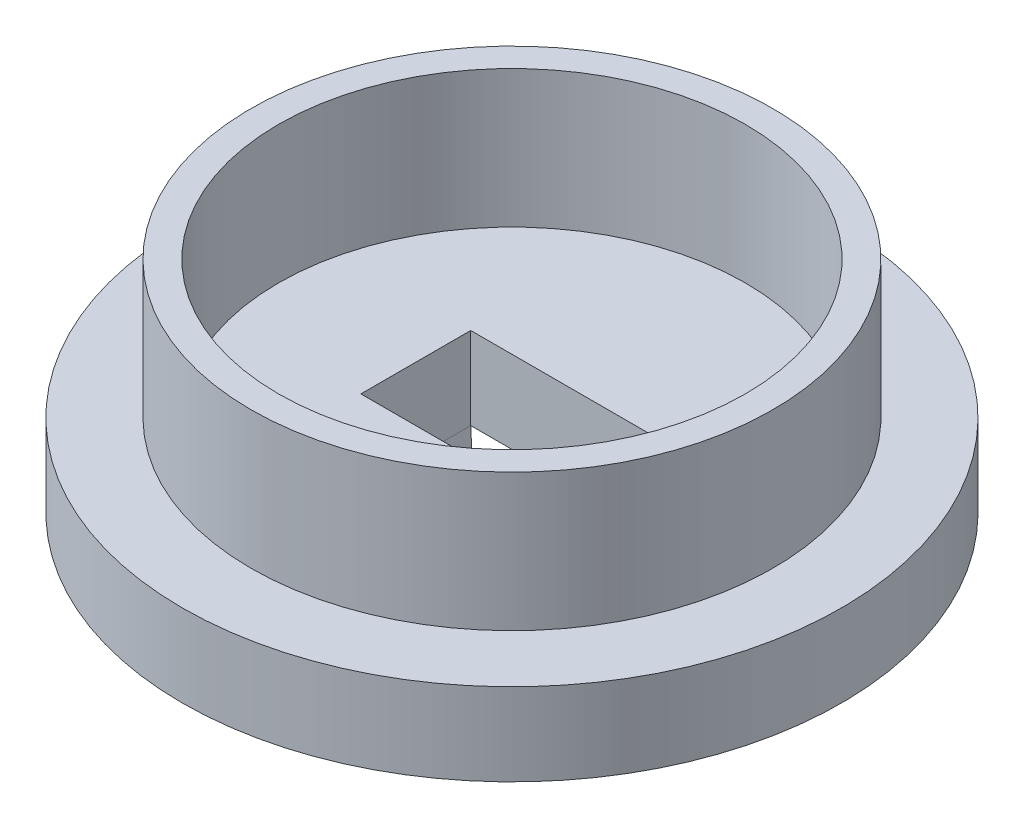
ISO-10303-21;
HEADER;
FILE_DESCRIPTION(('STEP AP214'),'2;1');
FILE_NAME('part.step','',(''),(''),'','','');
FILE_SCHEMA(('AUTOMOTIVE_DESIGN { 1 0 10303 214 1 1 1 1 }'));
ENDSEC;
DATA;
#1=APPLICATION_CONTEXT('core data for automotive mechanical design processes');
#2=APPLICATION_PROTOCOL_DEFINITION('international standard','automotive_design',2000,#1);
#3=PRODUCT_CONTEXT('',#1,'mechanical');
#4=PRODUCT('Part','Part','',(#3));
#5=PRODUCT_RELATED_PRODUCT_CATEGORY('part','',(#4));
#6=PRODUCT_DEFINITION_FORMATION('','',#4);
#7=PRODUCT_DEFINITION_CONTEXT('part definition',#1,'design');
#8=PRODUCT_DEFINITION('design','',#6,#7);
#9=PRODUCT_DEFINITION_SHAPE('','',#8);
#10=(LENGTH_UNIT() NAMED_UNIT(*) SI_UNIT(.MILLI.,.METRE.));
#11=(NAMED_UNIT(*) PLANE_ANGLE_UNIT() SI_UNIT($,.RADIAN.));
#12=(NAMED_UNIT(*) SI_UNIT($,.STERADIAN.) SOLID_ANGLE_UNIT());
#13=UNCERTAINTY_MEASURE_WITH_UNIT(LENGTH_MEASURE(1.E-05),#10,'distance_accuracy_value','');
#14=(GEOMETRIC_REPRESENTATION_CONTEXT(3) GLOBAL_UNCERTAINTY_ASSIGNED_CONTEXT((#13)) GLOBAL_UNIT_ASSIGNED_CONTEXT((#10,
#11,#12)) REPRESENTATION_CONTEXT('',''));
#15=CARTESIAN_POINT('',(0.,0.,0.));
#16=DIRECTION('',(0.,0.,1.));
#17=DIRECTION('',(1.,0.,0.));
#18=AXIS2_PLACEMENT_3D('',#15,#16,#17);
#19=CARTESIAN_POINT('',(0.,3.,0.));
#20=DIRECTION('',(0.,-1.,0.));
#21=DIRECTION('',(0.,0.,-1.));
#22=AXIS2_PLACEMENT_3D('',#19,#20,#21);
#23=CYLINDRICAL_SURFACE('',#22,12.);
#24=CARTESIAN_POINT('',(0.,3.,0.));
#25=DIRECTION('',(0.,1.,0.));
#26=DIRECTION('',(0.,0.,1.));
#27=AXIS2_PLACEMENT_3D('',#24,#25,#26);
#28=CIRCLE('',#27,12.);
#29=CARTESIAN_POINT('',(0.,3.,12.));
#30=VERTEX_POINT('',#29);
#31=EDGE_CURVE('E209',#30,#30,#28,.T.);
#32=ORIENTED_EDGE('',*,*,#31,.F.);
#33=EDGE_LOOP('',(#32));
#34=FACE_BOUND('',#33,.T.);
#35=CARTESIAN_POINT('',(0.,0.,0.));
#36=DIRECTION('',(0.,1.,0.));
#37=DIRECTION('',(0.,0.,1.));
#38=AXIS2_PLACEMENT_3D('',#35,#36,#37);
#39=CIRCLE('',#38,12.);
#40=CARTESIAN_POINT('',(0.,0.,12.));
#41=VERTEX_POINT('',#40);
#42=EDGE_CURVE('E206',#41,#41,#39,.T.);
#43=ORIENTED_EDGE('',*,*,#42,.T.);
#44=EDGE_LOOP('',(#43));
#45=FACE_BOUND('',#44,.T.);
#46=ADVANCED_FACE('F33',(#34,#45),#23,.T.);
#47=CARTESIAN_POINT('',(0.,3.,0.));
#48=DIRECTION('',(0.,1.,0.));
#49=DIRECTION('',(0.,0.,1.));
#50=AXIS2_PLACEMENT_3D('',#47,#48,#49);
#51=PLANE('',#50);
#52=CARTESIAN_POINT('',(0.,3.,0.));
#53=DIRECTION('',(0.,1.,0.));
#54=DIRECTION('',(0.,0.,1.));
#55=AXIS2_PLACEMENT_3D('',#52,#53,#54);
#56=CIRCLE('',#55,9.5);
#57=CARTESIAN_POINT('',(0.,3.,9.5));
#58=VERTEX_POINT('',#57);
#59=EDGE_CURVE('E202',#58,#58,#56,.T.);
#60=ORIENTED_EDGE('',*,*,#59,.F.);
#61=EDGE_LOOP('',(#60));
#62=FACE_BOUND('',#61,.T.);
#63=ORIENTED_EDGE('',*,*,#31,.T.);
#64=EDGE_LOOP('',(#63));
#65=FACE_BOUND('',#64,.T.);
#66=ADVANCED_FACE('F267',(#62,#65),#51,.T.);
#67=CARTESIAN_POINT('',(0.,0.,0.));
#68=DIRECTION('',(0.,1.,0.));
#69=DIRECTION('',(0.,0.,1.));
#70=AXIS2_PLACEMENT_3D('',#67,#68,#69);
#71=PLANE('',#70);
#72=DIRECTION('',(-1.,0.,0.));
#73=VECTOR('',#72,1.);
#74=CARTESIAN_POINT('',(-3.5,0.,2.));
#75=LINE('',#74,#73);
#76=CARTESIAN_POINT('',(3.5,0.,2.));
#77=VERTEX_POINT('',#76);
#78=CARTESIAN_POINT('',(-3.5,0.,2.));
#79=VERTEX_POINT('',#78);
#80=EDGE_CURVE('E181',#77,#79,#75,.T.);
#81=ORIENTED_EDGE('',*,*,#80,.F.);
#82=DIRECTION('',(-1.,0.,0.));
#83=VECTOR('',#82,1.);
#84=CARTESIAN_POINT('',(4.9,0.,2.));
#85=LINE('',#84,#83);
#86=CARTESIAN_POINT('',(4.9,0.,2.));
#87=VERTEX_POINT('',#86);
#88=EDGE_CURVE('E47',#87,#77,#85,.T.);
#89=ORIENTED_EDGE('',*,*,#88,.F.);
#90=DIRECTION('',(0.,0.,-1.));
#91=VECTOR('',#90,1.);
#92=CARTESIAN_POINT('',(4.9,0.,13.0018180315801));
#93=LINE('',#92,#91);
#94=CARTESIAN_POINT('',(4.9,0.,-2.));
#95=VERTEX_POINT('',#94);
#96=EDGE_CURVE('E173',#87,#95,#93,.T.);
#97=ORIENTED_EDGE('',*,*,#96,.T.);
#98=DIRECTION('',(-1.,0.,0.));
#99=VECTOR('',#98,1.);
#100=CARTESIAN_POINT('',(4.9,0.,-2.));
#101=LINE('',#100,#99);
#102=CARTESIAN_POINT('',(3.5,0.,-2.));
#103=VERTEX_POINT('',#102);
#104=EDGE_CURVE('E148',#95,#103,#101,.T.);
#105=ORIENTED_EDGE('',*,*,#104,.T.);
#106=DIRECTION('',(1.,0.,0.));
#107=VECTOR('',#106,1.);
#108=CARTESIAN_POINT('',(-3.5,0.,-2.));
#109=LINE('',#108,#107);
#110=CARTESIAN_POINT('',(-3.5,0.,-2.));
#111=VERTEX_POINT('',#110);
#112=EDGE_CURVE('E186',#111,#103,#109,.T.);
#113=ORIENTED_EDGE('',*,*,#112,.F.);
#114=DIRECTION('',(-1.,0.,0.));
#115=VECTOR('',#114,1.);
#116=CARTESIAN_POINT('',(-3.5,0.,-2.));
#117=LINE('',#116,#115);
#118=CARTESIAN_POINT('',(-4.9,0.,-2.));
#119=VERTEX_POINT('',#118);
#120=EDGE_CURVE('E138',#111,#119,#117,.T.);
#121=ORIENTED_EDGE('',*,*,#120,.T.);
#122=DIRECTION('',(0.,0.,-1.));
#123=VECTOR('',#122,1.);
#124=CARTESIAN_POINT('',(-4.9,0.,13.0018180315801));
#125=LINE('',#124,#123);
#126=CARTESIAN_POINT('',(-4.9,0.,2.));
#127=VERTEX_POINT('',#126);
#128=EDGE_CURVE('E122',#127,#119,#125,.T.);
#129=ORIENTED_EDGE('',*,*,#128,.F.);
#130=DIRECTION('',(-1.,0.,0.));
#131=VECTOR('',#130,1.);
#132=CARTESIAN_POINT('',(-3.5,0.,2.));
#133=LINE('',#132,#131);
#134=EDGE_CURVE('E164',#79,#127,#133,.T.);
#135=ORIENTED_EDGE('',*,*,#134,.F.);
#136=EDGE_LOOP('',(#81,#89,#97,#105,#113,#121,#129,#135));
#137=FACE_BOUND('',#136,.T.);
#138=ORIENTED_EDGE('',*,*,#42,.F.);
#139=EDGE_LOOP('',(#138));
#140=FACE_BOUND('',#139,.T.);
#141=ADVANCED_FACE('F246',(#137,#140),#71,.F.);
#142=CARTESIAN_POINT('',(0.,8.,0.));
#143=DIRECTION('',(0.,1.,0.));
#144=DIRECTION('',(0.,0.,1.));
#145=AXIS2_PLACEMENT_3D('',#142,#143,#144);
#146=PLANE('',#145);
#147=CARTESIAN_POINT('',(0.,8.,0.));
#148=DIRECTION('',(0.,1.,0.));
#149=DIRECTION('',(0.,0.,1.));
#150=AXIS2_PLACEMENT_3D('',#147,#148,#149);
#151=CIRCLE('',#150,9.5);
#152=CARTESIAN_POINT('',(0.,8.,9.5));
#153=VERTEX_POINT('',#152);
#154=EDGE_CURVE('E203',#153,#153,#151,.T.);
#155=ORIENTED_EDGE('',*,*,#154,.T.);
#156=EDGE_LOOP('',(#155));
#157=FACE_BOUND('',#156,.T.);
#158=CARTESIAN_POINT('',(0.,8.,0.));
#159=DIRECTION('',(0.,1.,0.));
#160=DIRECTION('',(0.,0.,1.));
#161=AXIS2_PLACEMENT_3D('',#158,#159,#160);
#162=CIRCLE('',#161,8.5);
#163=CARTESIAN_POINT('',(0.,8.,8.5));
#164=VERTEX_POINT('',#163);
#165=EDGE_CURVE('E193',#164,#164,#162,.T.);
#166=ORIENTED_EDGE('',*,*,#165,.F.);
#167=EDGE_LOOP('',(#166));
#168=FACE_BOUND('',#167,.T.);
#169=ADVANCED_FACE('F278',(#157,#168),#146,.T.);
#170=CARTESIAN_POINT('',(0.,8.,0.));
#171=DIRECTION('',(0.,-1.,0.));
#172=DIRECTION('',(0.,0.,-1.));
#173=AXIS2_PLACEMENT_3D('',#170,#171,#172);
#174=CYLINDRICAL_SURFACE('',#173,9.5);
#175=ORIENTED_EDGE('',*,*,#154,.F.);
#176=EDGE_LOOP('',(#175));
#177=FACE_BOUND('',#176,.T.);
#178=ORIENTED_EDGE('',*,*,#59,.T.);
#179=EDGE_LOOP('',(#178));
#180=FACE_BOUND('',#179,.T.);
#181=ADVANCED_FACE('F282',(#177,#180),#174,.T.);
#182=CARTESIAN_POINT('',(0.,8.,0.));
#183=DIRECTION('',(0.,-1.,0.));
#184=DIRECTION('',(0.,0.,-1.));
#185=AXIS2_PLACEMENT_3D('',#182,#183,#184);
#186=CYLINDRICAL_SURFACE('',#185,8.5);
#187=ORIENTED_EDGE('',*,*,#165,.T.);
#188=EDGE_LOOP('',(#187));
#189=FACE_BOUND('',#188,.T.);
#190=CARTESIAN_POINT('',(0.,3.,0.));
#191=DIRECTION('',(0.,1.,0.));
#192=DIRECTION('',(0.,0.,1.));
#193=AXIS2_PLACEMENT_3D('',#190,#191,#192);
#194=CIRCLE('',#193,8.5);
#195=CARTESIAN_POINT('',(0.,3.,8.5));
#196=VERTEX_POINT('',#195);
#197=EDGE_CURVE('E212',#196,#196,#194,.F.);
#198=ORIENTED_EDGE('',*,*,#197,.T.);
#199=EDGE_LOOP('',(#198));
#200=FACE_BOUND('',#199,.T.);
#201=ADVANCED_FACE('F287',(#189,#200),#186,.F.);
#202=DIRECTION('',(0.,0.,-1.));
#203=VECTOR('',#202,1.);
#204=CARTESIAN_POINT('',(3.5,3.,0.));
#205=LINE('',#204,#203);
#206=CARTESIAN_POINT('',(3.5,3.,2.));
#207=VERTEX_POINT('',#206);
#208=CARTESIAN_POINT('',(3.5,3.,-2.));
#209=VERTEX_POINT('',#208);
#210=EDGE_CURVE('E11',#207,#209,#205,.T.);
#211=ORIENTED_EDGE('',*,*,#210,.F.);
#212=DIRECTION('',(1.,0.,0.));
#213=VECTOR('',#212,1.);
#214=CARTESIAN_POINT('',(0.,3.,2.));
#215=LINE('',#214,#213);
#216=CARTESIAN_POINT('',(-3.5,3.,2.));
#217=VERTEX_POINT('',#216);
#218=EDGE_CURVE('E217',#217,#207,#215,.T.);
#219=ORIENTED_EDGE('',*,*,#218,.F.);
#220=DIRECTION('',(0.,0.,1.));
#221=VECTOR('',#220,1.);
#222=CARTESIAN_POINT('',(-3.5,3.,0.));
#223=LINE('',#222,#221);
#224=CARTESIAN_POINT('',(-3.5,3.,-2.));
#225=VERTEX_POINT('',#224);
#226=EDGE_CURVE('E219',#225,#217,#223,.T.);
#227=ORIENTED_EDGE('',*,*,#226,.F.);
#228=DIRECTION('',(-1.,0.,0.));
#229=VECTOR('',#228,1.);
#230=CARTESIAN_POINT('',(0.,3.,-2.));
#231=LINE('',#230,#229);
#232=EDGE_CURVE('E40',#209,#225,#231,.T.);
#233=ORIENTED_EDGE('',*,*,#232,.F.);
#234=EDGE_LOOP('',(#211,#219,#227,#233));
#235=FACE_BOUND('',#234,.T.);
#236=ORIENTED_EDGE('',*,*,#197,.F.);
#237=EDGE_LOOP('',(#236));
#238=FACE_BOUND('',#237,.T.);
#239=ADVANCED_FACE('F232',(#235,#238),#51,.T.);
#240=CARTESIAN_POINT('',(3.5,8.,2.));
#241=DIRECTION('',(1.,0.,0.));
#242=DIRECTION('',(0.,0.,-1.));
#243=AXIS2_PLACEMENT_3D('',#240,#241,#242);
#244=PLANE('',#243);
#245=ORIENTED_EDGE('',*,*,#210,.T.);
#246=DIRECTION('',(0.,-1.,0.));
#247=VECTOR('',#246,1.);
#248=CARTESIAN_POINT('',(3.5,8.,-2.));
#249=LINE('',#248,#247);
#250=EDGE_CURVE('E190',#209,#103,#249,.T.);
#251=ORIENTED_EDGE('',*,*,#250,.T.);
#252=DIRECTION('',(0.,0.,1.));
#253=VECTOR('',#252,1.);
#254=CARTESIAN_POINT('',(3.5,0.,2.));
#255=LINE('',#254,#253);
#256=EDGE_CURVE('E155',#103,#77,#255,.T.);
#257=ORIENTED_EDGE('',*,*,#256,.T.);
#258=DIRECTION('',(0.,-1.,0.));
#259=VECTOR('',#258,1.);
#260=CARTESIAN_POINT('',(3.5,8.,2.));
#261=LINE('',#260,#259);
#262=EDGE_CURVE('E189',#207,#77,#261,.T.);
#263=ORIENTED_EDGE('',*,*,#262,.F.);
#264=EDGE_LOOP('',(#245,#251,#257,#263));
#265=FACE_BOUND('',#264,.T.);
#266=ADVANCED_FACE('F238',(#265),#244,.F.);
#267=CARTESIAN_POINT('',(-3.5,8.,-2.));
#268=DIRECTION('',(0.,0.,-1.));
#269=DIRECTION('',(-1.,0.,0.));
#270=AXIS2_PLACEMENT_3D('',#267,#268,#269);
#271=PLANE('',#270);
#272=ORIENTED_EDGE('',*,*,#232,.T.);
#273=DIRECTION('',(0.,-1.,0.));
#274=VECTOR('',#273,1.);
#275=CARTESIAN_POINT('',(-3.5,8.,-2.));
#276=LINE('',#275,#274);
#277=EDGE_CURVE('E194',#225,#111,#276,.T.);
#278=ORIENTED_EDGE('',*,*,#277,.T.);
#279=ORIENTED_EDGE('',*,*,#112,.T.);
#280=ORIENTED_EDGE('',*,*,#250,.F.);
#281=EDGE_LOOP('',(#272,#278,#279,#280));
#282=FACE_BOUND('',#281,.T.);
#283=ADVANCED_FACE('F224',(#282),#271,.F.);
#284=CARTESIAN_POINT('',(-3.5,8.,2.));
#285=DIRECTION('',(-1.,0.,0.));
#286=DIRECTION('',(0.,0.,1.));
#287=AXIS2_PLACEMENT_3D('',#284,#285,#286);
#288=PLANE('',#287);
#289=ORIENTED_EDGE('',*,*,#226,.T.);
#290=DIRECTION('',(0.,-1.,0.));
#291=VECTOR('',#290,1.);
#292=CARTESIAN_POINT('',(-3.5,8.,2.));
#293=LINE('',#292,#291);
#294=EDGE_CURVE('E55',#217,#79,#293,.T.);
#295=ORIENTED_EDGE('',*,*,#294,.T.);
#296=DIRECTION('',(0.,0.,-1.));
#297=VECTOR('',#296,1.);
#298=CARTESIAN_POINT('',(-3.5,0.,2.));
#299=LINE('',#298,#297);
#300=EDGE_CURVE('E183',#79,#111,#299,.T.);
#301=ORIENTED_EDGE('',*,*,#300,.T.);
#302=ORIENTED_EDGE('',*,*,#277,.F.);
#303=EDGE_LOOP('',(#289,#295,#301,#302));
#304=FACE_BOUND('',#303,.T.);
#305=ADVANCED_FACE('F229',(#304),#288,.F.);
#306=CARTESIAN_POINT('',(-3.5,8.,2.));
#307=DIRECTION('',(0.,0.,1.));
#308=DIRECTION('',(1.,0.,0.));
#309=AXIS2_PLACEMENT_3D('',#306,#307,#308);
#310=PLANE('',#309);
#311=ORIENTED_EDGE('',*,*,#218,.T.);
#312=ORIENTED_EDGE('',*,*,#262,.T.);
#313=ORIENTED_EDGE('',*,*,#80,.T.);
#314=ORIENTED_EDGE('',*,*,#294,.F.);
#315=EDGE_LOOP('',(#311,#312,#313,#314));
#316=FACE_BOUND('',#315,.T.);
#317=ADVANCED_FACE('F235',(#316),#310,.F.);
#318=CARTESIAN_POINT('',(-4.9,0.,13.0018180315801));
#319=DIRECTION('',(0.998752338877845,0.0499376169438925,0.));
#320=DIRECTION('',(-0.0499376169438925,0.998752338877845,0.));
#321=AXIS2_PLACEMENT_3D('',#318,#319,#320);
#322=PLANE('',#321);
#323=DIRECTION('',(0.0499376169438925,-0.998752338877845,0.));
#324=VECTOR('',#323,1.);
#325=CARTESIAN_POINT('',(-4.9,0.,2.));
#326=LINE('',#325,#324);
#327=CARTESIAN_POINT('',(-4.65,-5.,2.));
#328=VERTEX_POINT('',#327);
#329=EDGE_CURVE('E162',#127,#328,#326,.T.);
#330=ORIENTED_EDGE('',*,*,#329,.F.);
#331=ORIENTED_EDGE('',*,*,#128,.T.);
#332=DIRECTION('',(0.0499376169438925,-0.998752338877845,0.));
#333=VECTOR('',#332,1.);
#334=CARTESIAN_POINT('',(-4.9,0.,-2.));
#335=LINE('',#334,#333);
#336=CARTESIAN_POINT('',(-4.65,-5.,-2.));
#337=VERTEX_POINT('',#336);
#338=EDGE_CURVE('E129',#119,#337,#335,.T.);
#339=ORIENTED_EDGE('',*,*,#338,.T.);
#340=DIRECTION('',(0.,0.,-1.));
#341=VECTOR('',#340,1.);
#342=CARTESIAN_POINT('',(-4.65,-5.,13.0018180315801));
#343=LINE('',#342,#341);
#344=EDGE_CURVE('E111',#328,#337,#343,.T.);
#345=ORIENTED_EDGE('',*,*,#344,.F.);
#346=EDGE_LOOP('',(#330,#331,#339,#345));
#347=FACE_BOUND('',#346,.T.);
#348=ADVANCED_FACE('F134',(#347),#322,.F.);
#349=CARTESIAN_POINT('',(-4.65,-5.,13.0018180315801));
#350=DIRECTION('',(0.,1.,0.));
#351=DIRECTION('',(-1.,0.,0.));
#352=AXIS2_PLACEMENT_3D('',#349,#350,#351);
#353=PLANE('',#352);
#354=DIRECTION('',(1.,0.,0.));
#355=VECTOR('',#354,1.);
#356=CARTESIAN_POINT('',(-4.65,-5.,2.));
#357=LINE('',#356,#355);
#358=CARTESIAN_POINT('',(4.65,-5.,2.));
#359=VERTEX_POINT('',#358);
#360=EDGE_CURVE('E117',#328,#359,#357,.T.);
#361=ORIENTED_EDGE('',*,*,#360,.F.);
#362=ORIENTED_EDGE('',*,*,#344,.T.);
#363=DIRECTION('',(1.,0.,0.));
#364=VECTOR('',#363,1.);
#365=CARTESIAN_POINT('',(-4.65,-5.,-2.));
#366=LINE('',#365,#364);
#367=CARTESIAN_POINT('',(4.65,-5.,-2.));
#368=VERTEX_POINT('',#367);
#369=EDGE_CURVE('E115',#337,#368,#366,.T.);
#370=ORIENTED_EDGE('',*,*,#369,.T.);
#371=DIRECTION('',(0.,0.,-1.));
#372=VECTOR('',#371,1.);
#373=CARTESIAN_POINT('',(4.65,-5.,13.0018180315801));
#374=LINE('',#373,#372);
#375=EDGE_CURVE('E121',#359,#368,#374,.T.);
#376=ORIENTED_EDGE('',*,*,#375,.F.);
#377=EDGE_LOOP('',(#361,#362,#370,#376));
#378=FACE_BOUND('',#377,.T.);
#379=ADVANCED_FACE('F113',(#378),#353,.F.);
#380=CARTESIAN_POINT('',(4.65,-5.,13.0018180315801));
#381=DIRECTION('',(-0.998752338877845,0.0499376169438921,0.));
#382=DIRECTION('',(-0.0499376169438921,-0.998752338877845,0.));
#383=AXIS2_PLACEMENT_3D('',#380,#381,#382);
#384=PLANE('',#383);
#385=DIRECTION('',(0.0499376169438921,0.998752338877845,0.));
#386=VECTOR('',#385,1.);
#387=CARTESIAN_POINT('',(4.65,-5.,2.));
#388=LINE('',#387,#386);
#389=EDGE_CURVE('E159',#359,#87,#388,.T.);
#390=ORIENTED_EDGE('',*,*,#389,.F.);
#391=ORIENTED_EDGE('',*,*,#375,.T.);
#392=DIRECTION('',(0.0499376169438921,0.998752338877845,0.));
#393=VECTOR('',#392,1.);
#394=CARTESIAN_POINT('',(4.65,-5.,-2.));
#395=LINE('',#394,#393);
#396=EDGE_CURVE('E132',#368,#95,#395,.T.);
#397=ORIENTED_EDGE('',*,*,#396,.T.);
#398=ORIENTED_EDGE('',*,*,#96,.F.);
#399=EDGE_LOOP('',(#390,#391,#397,#398));
#400=FACE_BOUND('',#399,.T.);
#401=ADVANCED_FACE('F249',(#400),#384,.F.);
#402=CARTESIAN_POINT('',(3.35,-3.,13.0018180315801));
#403=DIRECTION('',(0.998752338877845,-0.0499376169438927,0.));
#404=DIRECTION('',(0.0499376169438927,0.998752338877845,0.));
#405=AXIS2_PLACEMENT_3D('',#402,#403,#404);
#406=PLANE('',#405);
#407=DIRECTION('',(-0.0499376169438927,-0.998752338877845,0.));
#408=VECTOR('',#407,1.);
#409=CARTESIAN_POINT('',(3.35,-3.,2.));
#410=LINE('',#409,#408);
#411=CARTESIAN_POINT('',(3.35,-3.,2.));
#412=VERTEX_POINT('',#411);
#413=EDGE_CURVE('E156',#77,#412,#410,.T.);
#414=ORIENTED_EDGE('',*,*,#413,.F.);
#415=ORIENTED_EDGE('',*,*,#256,.F.);
#416=DIRECTION('',(-0.0499376169438927,-0.998752338877845,0.));
#417=VECTOR('',#416,1.);
#418=CARTESIAN_POINT('',(3.35,-3.,-2.));
#419=LINE('',#418,#417);
#420=CARTESIAN_POINT('',(3.35,-3.,-2.));
#421=VERTEX_POINT('',#420);
#422=EDGE_CURVE('E145',#103,#421,#419,.T.);
#423=ORIENTED_EDGE('',*,*,#422,.T.);
#424=DIRECTION('',(0.,0.,-1.));
#425=VECTOR('',#424,1.);
#426=CARTESIAN_POINT('',(3.35,-3.,13.0018180315801));
#427=LINE('',#426,#425);
#428=EDGE_CURVE('E176',#412,#421,#427,.T.);
#429=ORIENTED_EDGE('',*,*,#428,.F.);
#430=EDGE_LOOP('',(#414,#415,#423,#429));
#431=FACE_BOUND('',#430,.T.);
#432=ADVANCED_FACE('F241',(#431),#406,.F.);
#433=CARTESIAN_POINT('',(-3.35,-3.,13.0018180315801));
#434=DIRECTION('',(0.,-1.,0.));
#435=DIRECTION('',(1.,0.,0.));
#436=AXIS2_PLACEMENT_3D('',#433,#434,#435);
#437=PLANE('',#436);
#438=DIRECTION('',(-1.,0.,0.));
#439=VECTOR('',#438,1.);
#440=CARTESIAN_POINT('',(-3.35,-3.,2.));
#441=LINE('',#440,#439);
#442=CARTESIAN_POINT('',(-3.35,-3.,2.));
#443=VERTEX_POINT('',#442);
#444=EDGE_CURVE('E152',#412,#443,#441,.T.);
#445=ORIENTED_EDGE('',*,*,#444,.F.);
#446=ORIENTED_EDGE('',*,*,#428,.T.);
#447=DIRECTION('',(-1.,0.,0.));
#448=VECTOR('',#447,1.);
#449=CARTESIAN_POINT('',(-3.35,-3.,-2.));
#450=LINE('',#449,#448);
#451=CARTESIAN_POINT('',(-3.35,-3.,-2.));
#452=VERTEX_POINT('',#451);
#453=EDGE_CURVE('E142',#421,#452,#450,.T.);
#454=ORIENTED_EDGE('',*,*,#453,.T.);
#455=DIRECTION('',(0.,0.,-1.));
#456=VECTOR('',#455,1.);
#457=CARTESIAN_POINT('',(-3.35,-3.,13.0018180315801));
#458=LINE('',#457,#456);
#459=EDGE_CURVE('E170',#443,#452,#458,.T.);
#460=ORIENTED_EDGE('',*,*,#459,.F.);
#461=EDGE_LOOP('',(#445,#446,#454,#460));
#462=FACE_BOUND('',#461,.T.);
#463=ADVANCED_FACE('F255',(#462),#437,.F.);
#464=CARTESIAN_POINT('',(-3.5,0.,13.0018180315801));
#465=DIRECTION('',(-0.998752338877845,-0.0499376169438926,0.));
#466=DIRECTION('',(0.0499376169438926,-0.998752338877845,0.));
#467=AXIS2_PLACEMENT_3D('',#464,#465,#466);
#468=PLANE('',#467);
#469=DIRECTION('',(-0.0499376169438926,0.998752338877845,0.));
#470=VECTOR('',#469,1.);
#471=CARTESIAN_POINT('',(-3.5,0.,2.));
#472=LINE('',#471,#470);
#473=EDGE_CURVE('E167',#443,#79,#472,.T.);
#474=ORIENTED_EDGE('',*,*,#473,.F.);
#475=ORIENTED_EDGE('',*,*,#459,.T.);
#476=DIRECTION('',(-0.0499376169438926,0.998752338877845,0.));
#477=VECTOR('',#476,1.);
#478=CARTESIAN_POINT('',(-3.5,0.,-2.));
#479=LINE('',#478,#477);
#480=EDGE_CURVE('E140',#452,#111,#479,.T.);
#481=ORIENTED_EDGE('',*,*,#480,.T.);
#482=ORIENTED_EDGE('',*,*,#300,.F.);
#483=EDGE_LOOP('',(#474,#475,#481,#482));
#484=FACE_BOUND('',#483,.T.);
#485=ADVANCED_FACE('F256',(#484),#468,.F.);
#486=CARTESIAN_POINT('',(-3.5,8.,2.));
#487=DIRECTION('',(0.,0.,1.));
#488=DIRECTION('',(1.,0.,0.));
#489=AXIS2_PLACEMENT_3D('',#486,#487,#488);
#490=PLANE('',#489);
#491=ORIENTED_EDGE('',*,*,#473,.T.);
#492=ORIENTED_EDGE('',*,*,#134,.T.);
#493=ORIENTED_EDGE('',*,*,#329,.T.);
#494=ORIENTED_EDGE('',*,*,#360,.T.);
#495=ORIENTED_EDGE('',*,*,#389,.T.);
#496=ORIENTED_EDGE('',*,*,#88,.T.);
#497=ORIENTED_EDGE('',*,*,#413,.T.);
#498=ORIENTED_EDGE('',*,*,#444,.T.);
#499=EDGE_LOOP('',(#491,#492,#493,#494,#495,#496,#497,#498));
#500=FACE_BOUND('',#499,.T.);
#501=ADVANCED_FACE('F250',(#500),#490,.T.);
#502=CARTESIAN_POINT('',(-3.5,8.,-2.));
#503=DIRECTION('',(0.,0.,-1.));
#504=DIRECTION('',(-1.,0.,0.));
#505=AXIS2_PLACEMENT_3D('',#502,#503,#504);
#506=PLANE('',#505);
#507=ORIENTED_EDGE('',*,*,#120,.F.);
#508=ORIENTED_EDGE('',*,*,#480,.F.);
#509=ORIENTED_EDGE('',*,*,#453,.F.);
#510=ORIENTED_EDGE('',*,*,#422,.F.);
#511=ORIENTED_EDGE('',*,*,#104,.F.);
#512=ORIENTED_EDGE('',*,*,#396,.F.);
#513=ORIENTED_EDGE('',*,*,#369,.F.);
#514=ORIENTED_EDGE('',*,*,#338,.F.);
#515=EDGE_LOOP('',(#507,#508,#509,#510,#511,#512,#513,#514));
#516=FACE_BOUND('',#515,.T.);
#517=ADVANCED_FACE('F128',(#516),#506,.T.);
#518=CLOSED_SHELL('',(#46,#66,#141,#169,#181,#201,#239,#266,#283,#305,#317,#348,#379,#401,#432,
#463,#485,#501,#517));
#519=MANIFOLD_SOLID_BREP('B2',#518);
#520=ADVANCED_BREP_SHAPE_REPRESENTATION('',(#18,#519),#14);
#521=SHAPE_DEFINITION_REPRESENTATION(#9,#520);
ENDSEC;
END-ISO-10303-21;
